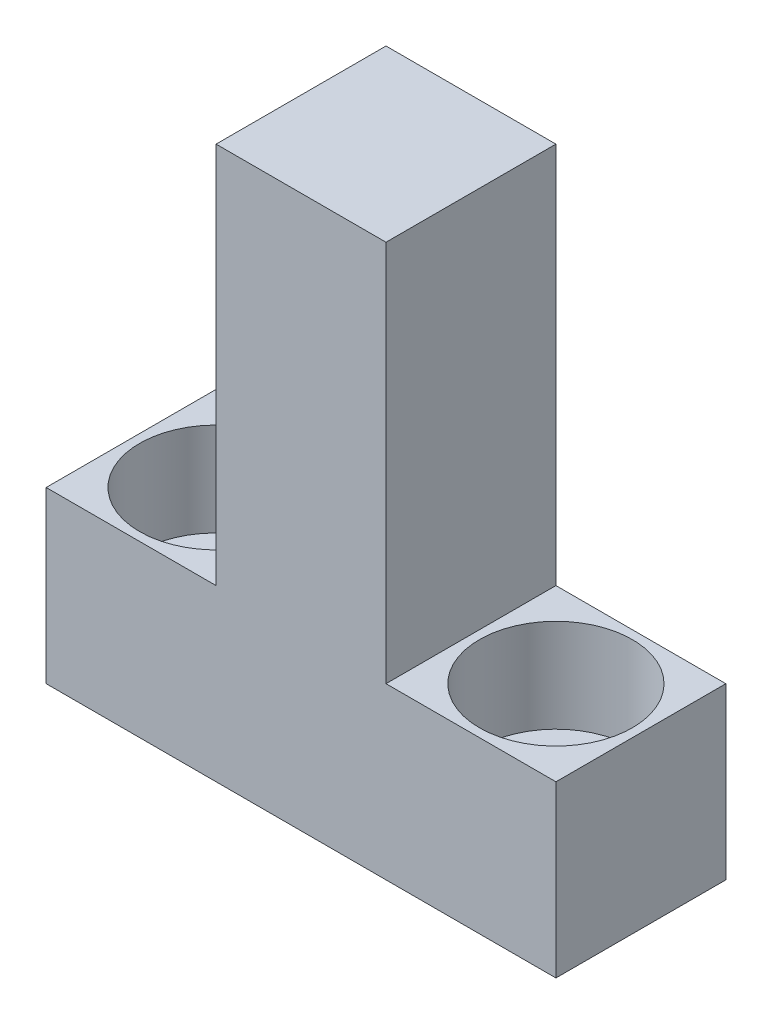
ISO-10303-21;
HEADER;
FILE_DESCRIPTION(('STEP AP214'),'2;1');
FILE_NAME('part.step','',(''),(''),'','','');
FILE_SCHEMA(('AUTOMOTIVE_DESIGN { 1 0 10303 214 1 1 1 1 }'));
ENDSEC;
DATA;
#1=APPLICATION_CONTEXT('core data for automotive mechanical design processes');
#2=APPLICATION_PROTOCOL_DEFINITION('international standard','automotive_design',2000,#1);
#3=PRODUCT_CONTEXT('',#1,'mechanical');
#4=PRODUCT('Part','Part','',(#3));
#5=PRODUCT_RELATED_PRODUCT_CATEGORY('part','',(#4));
#6=PRODUCT_DEFINITION_FORMATION('','',#4);
#7=PRODUCT_DEFINITION_CONTEXT('part definition',#1,'design');
#8=PRODUCT_DEFINITION('design','',#6,#7);
#9=PRODUCT_DEFINITION_SHAPE('','',#8);
#10=(LENGTH_UNIT() NAMED_UNIT(*) SI_UNIT(.MILLI.,.METRE.));
#11=(NAMED_UNIT(*) PLANE_ANGLE_UNIT() SI_UNIT($,.RADIAN.));
#12=(NAMED_UNIT(*) SI_UNIT($,.STERADIAN.) SOLID_ANGLE_UNIT());
#13=UNCERTAINTY_MEASURE_WITH_UNIT(LENGTH_MEASURE(1.E-05),#10,'distance_accuracy_value','');
#14=(GEOMETRIC_REPRESENTATION_CONTEXT(3) GLOBAL_UNCERTAINTY_ASSIGNED_CONTEXT((#13)) GLOBAL_UNIT_ASSIGNED_CONTEXT((#10,
#11,#12)) REPRESENTATION_CONTEXT('',''));
#15=CARTESIAN_POINT('',(0.,0.,0.));
#16=DIRECTION('',(0.,0.,1.));
#17=DIRECTION('',(1.,0.,0.));
#18=AXIS2_PLACEMENT_3D('',#15,#16,#17);
#19=CARTESIAN_POINT('',(0.,20.,0.));
#20=DIRECTION('',(0.,-1.,0.));
#21=DIRECTION('',(0.,0.,-1.));
#22=AXIS2_PLACEMENT_3D('',#19,#20,#21);
#23=PLANE('',#22);
#24=CARTESIAN_POINT('',(20.,20.,0.));
#25=DIRECTION('',(0.,1.,0.));
#26=DIRECTION('',(0.,0.,1.));
#27=AXIS2_PLACEMENT_3D('',#24,#25,#26);
#28=CIRCLE('',#27,9.);
#29=CARTESIAN_POINT('',(20.,20.,9.));
#30=VERTEX_POINT('',#29);
#31=EDGE_CURVE('E149',#30,#30,#28,.T.);
#32=ORIENTED_EDGE('',*,*,#31,.F.);
#33=EDGE_LOOP('',(#32));
#34=FACE_BOUND('',#33,.T.);
#35=DIRECTION('',(0.,0.,-1.));
#36=VECTOR('',#35,1.);
#37=CARTESIAN_POINT('',(10.,20.,10.));
#38=LINE('',#37,#36);
#39=CARTESIAN_POINT('',(10.,20.,10.));
#40=VERTEX_POINT('',#39);
#41=CARTESIAN_POINT('',(10.,20.,-10.));
#42=VERTEX_POINT('',#41);
#43=EDGE_CURVE('E34',#40,#42,#38,.T.);
#44=ORIENTED_EDGE('',*,*,#43,.F.);
#45=DIRECTION('',(1.,0.,0.));
#46=VECTOR('',#45,1.);
#47=CARTESIAN_POINT('',(-30.,20.,10.));
#48=LINE('',#47,#46);
#49=CARTESIAN_POINT('',(30.,20.,10.));
#50=VERTEX_POINT('',#49);
#51=EDGE_CURVE('E131',#40,#50,#48,.T.);
#52=ORIENTED_EDGE('',*,*,#51,.T.);
#53=DIRECTION('',(0.,0.,-1.));
#54=VECTOR('',#53,1.);
#55=CARTESIAN_POINT('',(30.,20.,10.));
#56=LINE('',#55,#54);
#57=CARTESIAN_POINT('',(30.,20.,-10.));
#58=VERTEX_POINT('',#57);
#59=EDGE_CURVE('E126',#50,#58,#56,.T.);
#60=ORIENTED_EDGE('',*,*,#59,.T.);
#61=DIRECTION('',(-1.,0.,0.));
#62=VECTOR('',#61,1.);
#63=CARTESIAN_POINT('',(-30.,20.,-10.));
#64=LINE('',#63,#62);
#65=EDGE_CURVE('E364',#58,#42,#64,.T.);
#66=ORIENTED_EDGE('',*,*,#65,.T.);
#67=EDGE_LOOP('',(#44,#52,#60,#66));
#68=FACE_BOUND('',#67,.T.);
#69=ADVANCED_FACE('F17',(#34,#68),#23,.F.);
#70=CARTESIAN_POINT('',(-20.,20.,0.));
#71=DIRECTION('',(0.,1.,0.));
#72=DIRECTION('',(0.,0.,1.));
#73=AXIS2_PLACEMENT_3D('',#70,#71,#72);
#74=CIRCLE('',#73,9.);
#75=CARTESIAN_POINT('',(-20.,20.,9.));
#76=VERTEX_POINT('',#75);
#77=EDGE_CURVE('E161',#76,#76,#74,.T.);
#78=ORIENTED_EDGE('',*,*,#77,.F.);
#79=EDGE_LOOP('',(#78));
#80=FACE_BOUND('',#79,.T.);
#81=DIRECTION('',(0.,0.,1.));
#82=VECTOR('',#81,1.);
#83=CARTESIAN_POINT('',(-10.,20.,10.));
#84=LINE('',#83,#82);
#85=CARTESIAN_POINT('',(-10.,20.,-10.));
#86=VERTEX_POINT('',#85);
#87=CARTESIAN_POINT('',(-10.,20.,10.));
#88=VERTEX_POINT('',#87);
#89=EDGE_CURVE('E42',#86,#88,#84,.T.);
#90=ORIENTED_EDGE('',*,*,#89,.F.);
#91=CARTESIAN_POINT('',(-30.,20.,-10.));
#92=VERTEX_POINT('',#91);
#93=EDGE_CURVE('E367',#86,#92,#64,.T.);
#94=ORIENTED_EDGE('',*,*,#93,.T.);
#95=DIRECTION('',(0.,0.,1.));
#96=VECTOR('',#95,1.);
#97=CARTESIAN_POINT('',(-30.,20.,10.));
#98=LINE('',#97,#96);
#99=CARTESIAN_POINT('',(-30.,20.,10.));
#100=VERTEX_POINT('',#99);
#101=EDGE_CURVE('E366',#92,#100,#98,.T.);
#102=ORIENTED_EDGE('',*,*,#101,.T.);
#103=EDGE_CURVE('E355',#100,#88,#48,.T.);
#104=ORIENTED_EDGE('',*,*,#103,.T.);
#105=EDGE_LOOP('',(#90,#94,#102,#104));
#106=FACE_BOUND('',#105,.T.);
#107=ADVANCED_FACE('F167',(#80,#106),#23,.F.);
#108=CARTESIAN_POINT('',(30.,20.,10.));
#109=DIRECTION('',(-1.,0.,0.));
#110=DIRECTION('',(0.,0.,1.));
#111=AXIS2_PLACEMENT_3D('',#108,#109,#110);
#112=PLANE('',#111);
#113=DIRECTION('',(0.,0.,-1.));
#114=VECTOR('',#113,1.);
#115=CARTESIAN_POINT('',(30.,0.,10.));
#116=LINE('',#115,#114);
#117=CARTESIAN_POINT('',(30.,0.,10.));
#118=VERTEX_POINT('',#117);
#119=CARTESIAN_POINT('',(30.,0.,-10.));
#120=VERTEX_POINT('',#119);
#121=EDGE_CURVE('E105',#118,#120,#116,.T.);
#122=ORIENTED_EDGE('',*,*,#121,.T.);
#123=DIRECTION('',(0.,-1.,0.));
#124=VECTOR('',#123,1.);
#125=CARTESIAN_POINT('',(30.,20.,-10.));
#126=LINE('',#125,#124);
#127=EDGE_CURVE('E11',#58,#120,#126,.T.);
#128=ORIENTED_EDGE('',*,*,#127,.F.);
#129=ORIENTED_EDGE('',*,*,#59,.F.);
#130=DIRECTION('',(0.,-1.,0.));
#131=VECTOR('',#130,1.);
#132=CARTESIAN_POINT('',(30.,20.,10.));
#133=LINE('',#132,#131);
#134=EDGE_CURVE('E352',#50,#118,#133,.T.);
#135=ORIENTED_EDGE('',*,*,#134,.T.);
#136=EDGE_LOOP('',(#122,#128,#129,#135));
#137=FACE_BOUND('',#136,.T.);
#138=ADVANCED_FACE('F19',(#137),#112,.F.);
#139=CARTESIAN_POINT('',(-30.,20.,-10.));
#140=DIRECTION('',(0.,0.,1.));
#141=DIRECTION('',(1.,0.,0.));
#142=AXIS2_PLACEMENT_3D('',#139,#140,#141);
#143=PLANE('',#142);
#144=DIRECTION('',(-1.,0.,0.));
#145=VECTOR('',#144,1.);
#146=CARTESIAN_POINT('',(-30.,0.,-10.));
#147=LINE('',#146,#145);
#148=CARTESIAN_POINT('',(-30.,0.,-10.));
#149=VERTEX_POINT('',#148);
#150=EDGE_CURVE('E108',#120,#149,#147,.T.);
#151=ORIENTED_EDGE('',*,*,#150,.T.);
#152=DIRECTION('',(0.,-1.,0.));
#153=VECTOR('',#152,1.);
#154=CARTESIAN_POINT('',(-30.,20.,-10.));
#155=LINE('',#154,#153);
#156=EDGE_CURVE('E26',#92,#149,#155,.T.);
#157=ORIENTED_EDGE('',*,*,#156,.F.);
#158=ORIENTED_EDGE('',*,*,#93,.F.);
#159=DIRECTION('',(0.,-1.,0.));
#160=VECTOR('',#159,1.);
#161=CARTESIAN_POINT('',(-10.,65.,-10.));
#162=LINE('',#161,#160);
#163=CARTESIAN_POINT('',(-10.,65.,-10.));
#164=VERTEX_POINT('',#163);
#165=EDGE_CURVE('E90',#164,#86,#162,.T.);
#166=ORIENTED_EDGE('',*,*,#165,.F.);
#167=DIRECTION('',(-1.,0.,0.));
#168=VECTOR('',#167,1.);
#169=CARTESIAN_POINT('',(-10.,65.,-10.));
#170=LINE('',#169,#168);
#171=CARTESIAN_POINT('',(10.,65.,-10.));
#172=VERTEX_POINT('',#171);
#173=EDGE_CURVE('E84',#172,#164,#170,.T.);
#174=ORIENTED_EDGE('',*,*,#173,.F.);
#175=DIRECTION('',(0.,-1.,0.));
#176=VECTOR('',#175,1.);
#177=CARTESIAN_POINT('',(10.,65.,-10.));
#178=LINE('',#177,#176);
#179=EDGE_CURVE('E88',#172,#42,#178,.T.);
#180=ORIENTED_EDGE('',*,*,#179,.T.);
#181=ORIENTED_EDGE('',*,*,#65,.F.);
#182=ORIENTED_EDGE('',*,*,#127,.T.);
#183=EDGE_LOOP('',(#151,#157,#158,#166,#174,#180,#181,#182));
#184=FACE_BOUND('',#183,.T.);
#185=ADVANCED_FACE('F86',(#184),#143,.F.);
#186=CARTESIAN_POINT('',(-30.,20.,10.));
#187=DIRECTION('',(1.,0.,0.));
#188=DIRECTION('',(0.,0.,-1.));
#189=AXIS2_PLACEMENT_3D('',#186,#187,#188);
#190=PLANE('',#189);
#191=DIRECTION('',(0.,0.,1.));
#192=VECTOR('',#191,1.);
#193=CARTESIAN_POINT('',(-30.,0.,10.));
#194=LINE('',#193,#192);
#195=CARTESIAN_POINT('',(-30.,0.,10.));
#196=VERTEX_POINT('',#195);
#197=EDGE_CURVE('E374',#149,#196,#194,.T.);
#198=ORIENTED_EDGE('',*,*,#197,.T.);
#199=DIRECTION('',(0.,-1.,0.));
#200=VECTOR('',#199,1.);
#201=CARTESIAN_POINT('',(-30.,20.,10.));
#202=LINE('',#201,#200);
#203=EDGE_CURVE('E354',#100,#196,#202,.T.);
#204=ORIENTED_EDGE('',*,*,#203,.F.);
#205=ORIENTED_EDGE('',*,*,#101,.F.);
#206=ORIENTED_EDGE('',*,*,#156,.T.);
#207=EDGE_LOOP('',(#198,#204,#205,#206));
#208=FACE_BOUND('',#207,.T.);
#209=ADVANCED_FACE('F188',(#208),#190,.F.);
#210=CARTESIAN_POINT('',(-30.,20.,10.));
#211=DIRECTION('',(0.,0.,-1.));
#212=DIRECTION('',(-1.,0.,0.));
#213=AXIS2_PLACEMENT_3D('',#210,#211,#212);
#214=PLANE('',#213);
#215=DIRECTION('',(1.,0.,0.));
#216=VECTOR('',#215,1.);
#217=CARTESIAN_POINT('',(-30.,0.,10.));
#218=LINE('',#217,#216);
#219=EDGE_CURVE('E347',#196,#118,#218,.T.);
#220=ORIENTED_EDGE('',*,*,#219,.T.);
#221=ORIENTED_EDGE('',*,*,#134,.F.);
#222=ORIENTED_EDGE('',*,*,#51,.F.);
#223=DIRECTION('',(0.,-1.,0.));
#224=VECTOR('',#223,1.);
#225=CARTESIAN_POINT('',(10.,65.,10.));
#226=LINE('',#225,#224);
#227=CARTESIAN_POINT('',(10.,65.,10.));
#228=VERTEX_POINT('',#227);
#229=EDGE_CURVE('E119',#228,#40,#226,.T.);
#230=ORIENTED_EDGE('',*,*,#229,.F.);
#231=DIRECTION('',(1.,0.,0.));
#232=VECTOR('',#231,1.);
#233=CARTESIAN_POINT('',(-10.,65.,10.));
#234=LINE('',#233,#232);
#235=CARTESIAN_POINT('',(-10.,65.,10.));
#236=VERTEX_POINT('',#235);
#237=EDGE_CURVE('E99',#236,#228,#234,.T.);
#238=ORIENTED_EDGE('',*,*,#237,.F.);
#239=DIRECTION('',(0.,-1.,0.));
#240=VECTOR('',#239,1.);
#241=CARTESIAN_POINT('',(-10.,65.,10.));
#242=LINE('',#241,#240);
#243=EDGE_CURVE('E110',#236,#88,#242,.T.);
#244=ORIENTED_EDGE('',*,*,#243,.T.);
#245=ORIENTED_EDGE('',*,*,#103,.F.);
#246=ORIENTED_EDGE('',*,*,#203,.T.);
#247=EDGE_LOOP('',(#220,#221,#222,#230,#238,#244,#245,#246));
#248=FACE_BOUND('',#247,.T.);
#249=ADVANCED_FACE('F184',(#248),#214,.F.);
#250=CARTESIAN_POINT('',(0.,0.,0.));
#251=DIRECTION('',(0.,-1.,0.));
#252=DIRECTION('',(0.,0.,-1.));
#253=AXIS2_PLACEMENT_3D('',#250,#251,#252);
#254=PLANE('',#253);
#255=CARTESIAN_POINT('',(-20.,0.,0.));
#256=DIRECTION('',(0.,1.,0.));
#257=DIRECTION('',(0.,0.,1.));
#258=AXIS2_PLACEMENT_3D('',#255,#256,#257);
#259=CIRCLE('',#258,6.);
#260=CARTESIAN_POINT('',(-20.,0.,6.));
#261=VERTEX_POINT('',#260);
#262=EDGE_CURVE('E152',#261,#261,#259,.T.);
#263=ORIENTED_EDGE('',*,*,#262,.T.);
#264=EDGE_LOOP('',(#263));
#265=FACE_BOUND('',#264,.T.);
#266=CARTESIAN_POINT('',(20.,0.,0.));
#267=DIRECTION('',(0.,1.,0.));
#268=DIRECTION('',(0.,0.,1.));
#269=AXIS2_PLACEMENT_3D('',#266,#267,#268);
#270=CIRCLE('',#269,6.);
#271=CARTESIAN_POINT('',(20.,0.,6.));
#272=VERTEX_POINT('',#271);
#273=EDGE_CURVE('E118',#272,#272,#270,.T.);
#274=ORIENTED_EDGE('',*,*,#273,.T.);
#275=EDGE_LOOP('',(#274));
#276=FACE_BOUND('',#275,.T.);
#277=ORIENTED_EDGE('',*,*,#121,.F.);
#278=ORIENTED_EDGE('',*,*,#219,.F.);
#279=ORIENTED_EDGE('',*,*,#197,.F.);
#280=ORIENTED_EDGE('',*,*,#150,.F.);
#281=EDGE_LOOP('',(#277,#278,#279,#280));
#282=FACE_BOUND('',#281,.T.);
#283=ADVANCED_FACE('F181',(#265,#276,#282),#254,.T.);
#284=CARTESIAN_POINT('',(10.,65.,10.));
#285=DIRECTION('',(-1.,0.,0.));
#286=DIRECTION('',(0.,0.,1.));
#287=AXIS2_PLACEMENT_3D('',#284,#285,#286);
#288=PLANE('',#287);
#289=ORIENTED_EDGE('',*,*,#43,.T.);
#290=ORIENTED_EDGE('',*,*,#179,.F.);
#291=DIRECTION('',(0.,0.,-1.));
#292=VECTOR('',#291,1.);
#293=CARTESIAN_POINT('',(10.,65.,10.));
#294=LINE('',#293,#292);
#295=EDGE_CURVE('E94',#228,#172,#294,.T.);
#296=ORIENTED_EDGE('',*,*,#295,.F.);
#297=ORIENTED_EDGE('',*,*,#229,.T.);
#298=EDGE_LOOP('',(#289,#290,#296,#297));
#299=FACE_BOUND('',#298,.T.);
#300=ADVANCED_FACE('F104',(#299),#288,.F.);
#301=CARTESIAN_POINT('',(-10.,65.,10.));
#302=DIRECTION('',(1.,0.,0.));
#303=DIRECTION('',(0.,0.,-1.));
#304=AXIS2_PLACEMENT_3D('',#301,#302,#303);
#305=PLANE('',#304);
#306=ORIENTED_EDGE('',*,*,#89,.T.);
#307=ORIENTED_EDGE('',*,*,#243,.F.);
#308=DIRECTION('',(0.,0.,1.));
#309=VECTOR('',#308,1.);
#310=CARTESIAN_POINT('',(-10.,65.,10.));
#311=LINE('',#310,#309);
#312=EDGE_CURVE('E93',#164,#236,#311,.T.);
#313=ORIENTED_EDGE('',*,*,#312,.F.);
#314=ORIENTED_EDGE('',*,*,#165,.T.);
#315=EDGE_LOOP('',(#306,#307,#313,#314));
#316=FACE_BOUND('',#315,.T.);
#317=ADVANCED_FACE('F223',(#316),#305,.F.);
#318=CARTESIAN_POINT('',(0.,65.,0.));
#319=DIRECTION('',(0.,-1.,0.));
#320=DIRECTION('',(0.,0.,-1.));
#321=AXIS2_PLACEMENT_3D('',#318,#319,#320);
#322=PLANE('',#321);
#323=ORIENTED_EDGE('',*,*,#295,.T.);
#324=ORIENTED_EDGE('',*,*,#173,.T.);
#325=ORIENTED_EDGE('',*,*,#312,.T.);
#326=ORIENTED_EDGE('',*,*,#237,.T.);
#327=EDGE_LOOP('',(#323,#324,#325,#326));
#328=FACE_BOUND('',#327,.T.);
#329=ADVANCED_FACE('F97',(#328),#322,.F.);
#330=CARTESIAN_POINT('',(20.,20.,0.));
#331=DIRECTION('',(0.,1.,0.));
#332=DIRECTION('',(0.,0.,1.));
#333=AXIS2_PLACEMENT_3D('',#330,#331,#332);
#334=CYLINDRICAL_SURFACE('',#333,6.);
#335=ORIENTED_EDGE('',*,*,#273,.F.);
#336=EDGE_LOOP('',(#335));
#337=FACE_BOUND('',#336,.T.);
#338=CARTESIAN_POINT('',(20.,9.,0.));
#339=DIRECTION('',(0.,1.,0.));
#340=DIRECTION('',(0.,0.,1.));
#341=AXIS2_PLACEMENT_3D('',#338,#339,#340);
#342=CIRCLE('',#341,6.);
#343=CARTESIAN_POINT('',(20.,9.,6.));
#344=VERTEX_POINT('',#343);
#345=EDGE_CURVE('E143',#344,#344,#342,.T.);
#346=ORIENTED_EDGE('',*,*,#345,.T.);
#347=EDGE_LOOP('',(#346));
#348=FACE_BOUND('',#347,.T.);
#349=ADVANCED_FACE('F237',(#337,#348),#334,.F.);
#350=CARTESIAN_POINT('',(26.,9.,0.));
#351=DIRECTION('',(0.,-1.,0.));
#352=DIRECTION('',(0.,0.,-1.));
#353=AXIS2_PLACEMENT_3D('',#350,#351,#352);
#354=PLANE('',#353);
#355=ORIENTED_EDGE('',*,*,#345,.F.);
#356=EDGE_LOOP('',(#355));
#357=FACE_BOUND('',#356,.T.);
#358=CARTESIAN_POINT('',(20.,9.,0.));
#359=DIRECTION('',(0.,1.,0.));
#360=DIRECTION('',(0.,0.,1.));
#361=AXIS2_PLACEMENT_3D('',#358,#359,#360);
#362=CIRCLE('',#361,9.);
#363=CARTESIAN_POINT('',(20.,9.,9.));
#364=VERTEX_POINT('',#363);
#365=EDGE_CURVE('E146',#364,#364,#362,.T.);
#366=ORIENTED_EDGE('',*,*,#365,.T.);
#367=EDGE_LOOP('',(#366));
#368=FACE_BOUND('',#367,.T.);
#369=ADVANCED_FACE('F246',(#357,#368),#354,.F.);
#370=CARTESIAN_POINT('',(20.,20.,0.));
#371=DIRECTION('',(0.,1.,0.));
#372=DIRECTION('',(0.,0.,1.));
#373=AXIS2_PLACEMENT_3D('',#370,#371,#372);
#374=CYLINDRICAL_SURFACE('',#373,9.);
#375=ORIENTED_EDGE('',*,*,#365,.F.);
#376=EDGE_LOOP('',(#375));
#377=FACE_BOUND('',#376,.T.);
#378=ORIENTED_EDGE('',*,*,#31,.T.);
#379=EDGE_LOOP('',(#378));
#380=FACE_BOUND('',#379,.T.);
#381=ADVANCED_FACE('F259',(#377,#380),#374,.F.);
#382=CARTESIAN_POINT('',(-20.,20.,0.));
#383=DIRECTION('',(0.,1.,0.));
#384=DIRECTION('',(0.,0.,1.));
#385=AXIS2_PLACEMENT_3D('',#382,#383,#384);
#386=CYLINDRICAL_SURFACE('',#385,6.);
#387=ORIENTED_EDGE('',*,*,#262,.F.);
#388=EDGE_LOOP('',(#387));
#389=FACE_BOUND('',#388,.T.);
#390=CARTESIAN_POINT('',(-20.,9.,0.));
#391=DIRECTION('',(0.,1.,0.));
#392=DIRECTION('',(0.,0.,1.));
#393=AXIS2_PLACEMENT_3D('',#390,#391,#392);
#394=CIRCLE('',#393,6.);
#395=CARTESIAN_POINT('',(-20.,9.,6.));
#396=VERTEX_POINT('',#395);
#397=EDGE_CURVE('E155',#396,#396,#394,.T.);
#398=ORIENTED_EDGE('',*,*,#397,.T.);
#399=EDGE_LOOP('',(#398));
#400=FACE_BOUND('',#399,.T.);
#401=ADVANCED_FACE('F270',(#389,#400),#386,.F.);
#402=CARTESIAN_POINT('',(-14.,9.,0.));
#403=DIRECTION('',(0.,-1.,0.));
#404=DIRECTION('',(0.,0.,-1.));
#405=AXIS2_PLACEMENT_3D('',#402,#403,#404);
#406=PLANE('',#405);
#407=ORIENTED_EDGE('',*,*,#397,.F.);
#408=EDGE_LOOP('',(#407));
#409=FACE_BOUND('',#408,.T.);
#410=CARTESIAN_POINT('',(-20.,9.,0.));
#411=DIRECTION('',(0.,1.,0.));
#412=DIRECTION('',(0.,0.,1.));
#413=AXIS2_PLACEMENT_3D('',#410,#411,#412);
#414=CIRCLE('',#413,9.);
#415=CARTESIAN_POINT('',(-20.,9.,9.));
#416=VERTEX_POINT('',#415);
#417=EDGE_CURVE('E158',#416,#416,#414,.T.);
#418=ORIENTED_EDGE('',*,*,#417,.T.);
#419=EDGE_LOOP('',(#418));
#420=FACE_BOUND('',#419,.T.);
#421=ADVANCED_FACE('F281',(#409,#420),#406,.F.);
#422=CARTESIAN_POINT('',(-20.,20.,0.));
#423=DIRECTION('',(0.,1.,0.));
#424=DIRECTION('',(0.,0.,1.));
#425=AXIS2_PLACEMENT_3D('',#422,#423,#424);
#426=CYLINDRICAL_SURFACE('',#425,9.);
#427=ORIENTED_EDGE('',*,*,#417,.F.);
#428=EDGE_LOOP('',(#427));
#429=FACE_BOUND('',#428,.T.);
#430=ORIENTED_EDGE('',*,*,#77,.T.);
#431=EDGE_LOOP('',(#430));
#432=FACE_BOUND('',#431,.T.);
#433=ADVANCED_FACE('F165',(#429,#432),#426,.F.);
#434=CLOSED_SHELL('',(#69,#107,#138,#185,#209,#249,#283,#300,#317,#329,#349,#369,#381,#401,#421,#433));
#435=MANIFOLD_SOLID_BREP('B1',#434);
#436=ADVANCED_BREP_SHAPE_REPRESENTATION('',(#18,#435),#14);
#437=SHAPE_DEFINITION_REPRESENTATION(#9,#436);
ENDSEC;
END-ISO-10303-21;
